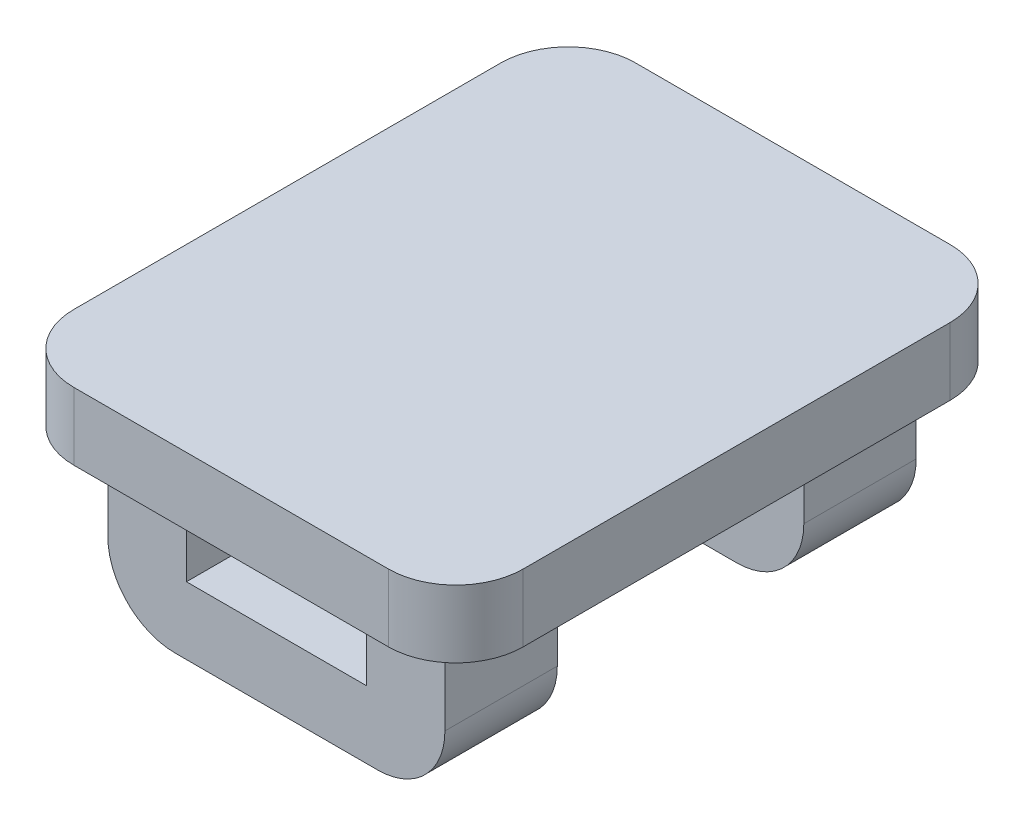
ISO-10303-21;
HEADER;
FILE_DESCRIPTION(('STEP AP214'),'2;1');
FILE_NAME('part.step','',(''),(''),'','','');
FILE_SCHEMA(('AUTOMOTIVE_DESIGN { 1 0 10303 214 1 1 1 1 }'));
ENDSEC;
DATA;
#1=APPLICATION_CONTEXT('core data for automotive mechanical design processes');
#2=APPLICATION_PROTOCOL_DEFINITION('international standard','automotive_design',2000,#1);
#3=PRODUCT_CONTEXT('',#1,'mechanical');
#4=PRODUCT('Part','Part','',(#3));
#5=PRODUCT_RELATED_PRODUCT_CATEGORY('part','',(#4));
#6=PRODUCT_DEFINITION_FORMATION('','',#4);
#7=PRODUCT_DEFINITION_CONTEXT('part definition',#1,'design');
#8=PRODUCT_DEFINITION('design','',#6,#7);
#9=PRODUCT_DEFINITION_SHAPE('','',#8);
#10=(LENGTH_UNIT() NAMED_UNIT(*) SI_UNIT(.MILLI.,.METRE.));
#11=(NAMED_UNIT(*) PLANE_ANGLE_UNIT() SI_UNIT($,.RADIAN.));
#12=(NAMED_UNIT(*) SI_UNIT($,.STERADIAN.) SOLID_ANGLE_UNIT());
#13=UNCERTAINTY_MEASURE_WITH_UNIT(LENGTH_MEASURE(1.E-05),#10,'distance_accuracy_value','');
#14=(GEOMETRIC_REPRESENTATION_CONTEXT(3) GLOBAL_UNCERTAINTY_ASSIGNED_CONTEXT((#13)) GLOBAL_UNIT_ASSIGNED_CONTEXT((#10,
#11,#12)) REPRESENTATION_CONTEXT('',''));
#15=CARTESIAN_POINT('',(0.,0.,0.));
#16=DIRECTION('',(0.,0.,1.));
#17=DIRECTION('',(1.,0.,0.));
#18=AXIS2_PLACEMENT_3D('',#15,#16,#17);
#19=CARTESIAN_POINT('',(0.,0.,0.));
#20=DIRECTION('',(0.,-1.,0.));
#21=DIRECTION('',(0.,0.,-1.));
#22=AXIS2_PLACEMENT_3D('',#19,#20,#21);
#23=PLANE('',#22);
#24=DIRECTION('',(-1.,0.,0.));
#25=VECTOR('',#24,1.);
#26=CARTESIAN_POINT('',(-10.,0.,-12.5));
#27=LINE('',#26,#25);
#28=CARTESIAN_POINT('',(7.,0.,-12.5));
#29=VERTEX_POINT('',#28);
#30=CARTESIAN_POINT('',(-7.,0.,-12.5));
#31=VERTEX_POINT('',#30);
#32=EDGE_CURVE('E394',#29,#31,#27,.T.);
#33=ORIENTED_EDGE('',*,*,#32,.F.);
#34=CARTESIAN_POINT('',(7.,0.,-9.5));
#35=DIRECTION('',(0.,-1.,0.));
#36=DIRECTION('',(0.,0.,-1.));
#37=AXIS2_PLACEMENT_3D('',#34,#35,#36);
#38=CIRCLE('',#37,3.);
#39=CARTESIAN_POINT('',(10.,0.,-9.5));
#40=VERTEX_POINT('',#39);
#41=EDGE_CURVE('E420',#29,#40,#38,.T.);
#42=ORIENTED_EDGE('',*,*,#41,.T.);
#43=DIRECTION('',(0.,0.,-1.));
#44=VECTOR('',#43,1.);
#45=CARTESIAN_POINT('',(10.,0.,12.5));
#46=LINE('',#45,#44);
#47=CARTESIAN_POINT('',(10.,0.,9.5));
#48=VERTEX_POINT('',#47);
#49=EDGE_CURVE('E372',#48,#40,#46,.T.);
#50=ORIENTED_EDGE('',*,*,#49,.F.);
#51=CARTESIAN_POINT('',(7.,0.,9.5));
#52=DIRECTION('',(0.,-1.,0.));
#53=DIRECTION('',(0.,0.,-1.));
#54=AXIS2_PLACEMENT_3D('',#51,#52,#53);
#55=CIRCLE('',#54,3.);
#56=CARTESIAN_POINT('',(7.,0.,12.5));
#57=VERTEX_POINT('',#56);
#58=EDGE_CURVE('E411',#48,#57,#55,.T.);
#59=ORIENTED_EDGE('',*,*,#58,.T.);
#60=DIRECTION('',(1.,0.,0.));
#61=VECTOR('',#60,1.);
#62=CARTESIAN_POINT('',(-10.,0.,12.5));
#63=LINE('',#62,#61);
#64=CARTESIAN_POINT('',(-7.,0.,12.5));
#65=VERTEX_POINT('',#64);
#66=EDGE_CURVE('E378',#65,#57,#63,.T.);
#67=ORIENTED_EDGE('',*,*,#66,.F.);
#68=CARTESIAN_POINT('',(-7.,0.,9.5));
#69=DIRECTION('',(0.,-1.,0.));
#70=DIRECTION('',(0.,0.,-1.));
#71=AXIS2_PLACEMENT_3D('',#68,#69,#70);
#72=CIRCLE('',#71,3.);
#73=CARTESIAN_POINT('',(-10.,0.,9.5));
#74=VERTEX_POINT('',#73);
#75=EDGE_CURVE('E414',#65,#74,#72,.T.);
#76=ORIENTED_EDGE('',*,*,#75,.T.);
#77=DIRECTION('',(0.,0.,1.));
#78=VECTOR('',#77,1.);
#79=CARTESIAN_POINT('',(-10.,0.,12.5));
#80=LINE('',#79,#78);
#81=CARTESIAN_POINT('',(-10.,0.,-9.5));
#82=VERTEX_POINT('',#81);
#83=EDGE_CURVE('E398',#82,#74,#80,.T.);
#84=ORIENTED_EDGE('',*,*,#83,.F.);
#85=CARTESIAN_POINT('',(-7.,0.,-9.5));
#86=DIRECTION('',(0.,-1.,0.));
#87=DIRECTION('',(0.,0.,-1.));
#88=AXIS2_PLACEMENT_3D('',#85,#86,#87);
#89=CIRCLE('',#88,3.);
#90=EDGE_CURVE('E417',#82,#31,#89,.T.);
#91=ORIENTED_EDGE('',*,*,#90,.T.);
#92=EDGE_LOOP('',(#33,#42,#50,#59,#67,#76,#84,#91));
#93=FACE_BOUND('',#92,.T.);
#94=DIRECTION('',(1.,0.,0.));
#95=VECTOR('',#94,1.);
#96=CARTESIAN_POINT('',(7.5,0.,-10.4849434227831));
#97=LINE('',#96,#95);
#98=CARTESIAN_POINT('',(-7.5,0.,-10.4849434227831));
#99=VERTEX_POINT('',#98);
#100=CARTESIAN_POINT('',(7.5,0.,-10.4849434227831));
#101=VERTEX_POINT('',#100);
#102=EDGE_CURVE('E350',#99,#101,#97,.T.);
#103=ORIENTED_EDGE('',*,*,#102,.F.);
#104=DIRECTION('',(0.,0.,-1.));
#105=VECTOR('',#104,1.);
#106=CARTESIAN_POINT('',(-7.5,0.,-10.4849434227831));
#107=LINE('',#106,#105);
#108=CARTESIAN_POINT('',(-7.50000000000001,0.,-5.48494342278312));
#109=VERTEX_POINT('',#108);
#110=EDGE_CURVE('E336',#109,#99,#107,.T.);
#111=ORIENTED_EDGE('',*,*,#110,.F.);
#112=DIRECTION('',(-1.,0.,0.));
#113=VECTOR('',#112,1.);
#114=CARTESIAN_POINT('',(7.5,0.,-5.48494342278311));
#115=LINE('',#114,#113);
#116=CARTESIAN_POINT('',(7.5,0.,-5.48494342278311));
#117=VERTEX_POINT('',#116);
#118=EDGE_CURVE('E342',#117,#109,#115,.T.);
#119=ORIENTED_EDGE('',*,*,#118,.F.);
#120=DIRECTION('',(0.,0.,1.));
#121=VECTOR('',#120,1.);
#122=CARTESIAN_POINT('',(7.5,0.,-10.4849434227831));
#123=LINE('',#122,#121);
#124=EDGE_CURVE('E354',#101,#117,#123,.T.);
#125=ORIENTED_EDGE('',*,*,#124,.F.);
#126=EDGE_LOOP('',(#103,#111,#119,#125));
#127=FACE_BOUND('',#126,.T.);
#128=DIRECTION('',(-1.,0.,0.));
#129=VECTOR('',#128,1.);
#130=CARTESIAN_POINT('',(7.5,0.,10.4849434227831));
#131=LINE('',#130,#129);
#132=CARTESIAN_POINT('',(7.5,0.,10.4849434227831));
#133=VERTEX_POINT('',#132);
#134=CARTESIAN_POINT('',(-7.5,0.,10.4849434227831));
#135=VERTEX_POINT('',#134);
#136=EDGE_CURVE('E314',#133,#135,#131,.T.);
#137=ORIENTED_EDGE('',*,*,#136,.F.);
#138=DIRECTION('',(0.,0.,1.));
#139=VECTOR('',#138,1.);
#140=CARTESIAN_POINT('',(7.5,0.,10.4849434227831));
#141=LINE('',#140,#139);
#142=CARTESIAN_POINT('',(7.5,0.,5.48494342278311));
#143=VERTEX_POINT('',#142);
#144=EDGE_CURVE('E300',#143,#133,#141,.T.);
#145=ORIENTED_EDGE('',*,*,#144,.F.);
#146=DIRECTION('',(1.,0.,0.));
#147=VECTOR('',#146,1.);
#148=CARTESIAN_POINT('',(7.5,0.,5.48494342278311));
#149=LINE('',#148,#147);
#150=CARTESIAN_POINT('',(-7.50000000000001,0.,5.48494342278312));
#151=VERTEX_POINT('',#150);
#152=EDGE_CURVE('E306',#151,#143,#149,.T.);
#153=ORIENTED_EDGE('',*,*,#152,.F.);
#154=DIRECTION('',(0.,0.,-1.));
#155=VECTOR('',#154,1.);
#156=CARTESIAN_POINT('',(-7.5,0.,10.4849434227831));
#157=LINE('',#156,#155);
#158=EDGE_CURVE('E318',#135,#151,#157,.T.);
#159=ORIENTED_EDGE('',*,*,#158,.F.);
#160=EDGE_LOOP('',(#137,#145,#153,#159));
#161=FACE_BOUND('',#160,.T.);
#162=ADVANCED_FACE('F39',(#93,#127,#161),#23,.T.);
#163=CARTESIAN_POINT('',(10.,3.,12.5));
#164=DIRECTION('',(-1.,0.,0.));
#165=DIRECTION('',(0.,0.,1.));
#166=AXIS2_PLACEMENT_3D('',#163,#164,#165);
#167=PLANE('',#166);
#168=ORIENTED_EDGE('',*,*,#49,.T.);
#169=DIRECTION('',(0.,-1.,0.));
#170=VECTOR('',#169,1.);
#171=CARTESIAN_POINT('',(10.,3.,-9.5));
#172=LINE('',#171,#170);
#173=CARTESIAN_POINT('',(10.,3.,-9.5));
#174=VERTEX_POINT('',#173);
#175=EDGE_CURVE('E427',#40,#174,#172,.F.);
#176=ORIENTED_EDGE('',*,*,#175,.T.);
#177=DIRECTION('',(0.,0.,-1.));
#178=VECTOR('',#177,1.);
#179=CARTESIAN_POINT('',(10.,3.,12.5));
#180=LINE('',#179,#178);
#181=CARTESIAN_POINT('',(10.,3.,9.5));
#182=VERTEX_POINT('',#181);
#183=EDGE_CURVE('E373',#182,#174,#180,.T.);
#184=ORIENTED_EDGE('',*,*,#183,.F.);
#185=DIRECTION('',(0.,-1.,0.));
#186=VECTOR('',#185,1.);
#187=CARTESIAN_POINT('',(10.,3.,9.5));
#188=LINE('',#187,#186);
#189=EDGE_CURVE('E423',#182,#48,#188,.T.);
#190=ORIENTED_EDGE('',*,*,#189,.T.);
#191=EDGE_LOOP('',(#168,#176,#184,#190));
#192=FACE_BOUND('',#191,.T.);
#193=ADVANCED_FACE('F548',(#192),#167,.F.);
#194=CARTESIAN_POINT('',(-10.,3.,-12.5));
#195=DIRECTION('',(0.,0.,1.));
#196=DIRECTION('',(1.,0.,0.));
#197=AXIS2_PLACEMENT_3D('',#194,#195,#196);
#198=PLANE('',#197);
#199=DIRECTION('',(-1.,0.,0.));
#200=VECTOR('',#199,1.);
#201=CARTESIAN_POINT('',(-10.,3.,-12.5));
#202=LINE('',#201,#200);
#203=CARTESIAN_POINT('',(7.,3.,-12.5));
#204=VERTEX_POINT('',#203);
#205=CARTESIAN_POINT('',(-7.,3.,-12.5));
#206=VERTEX_POINT('',#205);
#207=EDGE_CURVE('E377',#204,#206,#202,.T.);
#208=ORIENTED_EDGE('',*,*,#207,.F.);
#209=DIRECTION('',(0.,-1.,0.));
#210=VECTOR('',#209,1.);
#211=CARTESIAN_POINT('',(7.,3.,-12.5));
#212=LINE('',#211,#210);
#213=EDGE_CURVE('E407',#204,#29,#212,.T.);
#214=ORIENTED_EDGE('',*,*,#213,.T.);
#215=ORIENTED_EDGE('',*,*,#32,.T.);
#216=DIRECTION('',(0.,-1.,0.));
#217=VECTOR('',#216,1.);
#218=CARTESIAN_POINT('',(-7.,3.,-12.5));
#219=LINE('',#218,#217);
#220=EDGE_CURVE('E390',#31,#206,#219,.F.);
#221=ORIENTED_EDGE('',*,*,#220,.T.);
#222=EDGE_LOOP('',(#208,#214,#215,#221));
#223=FACE_BOUND('',#222,.T.);
#224=ADVANCED_FACE('F554',(#223),#198,.F.);
#225=CARTESIAN_POINT('',(-10.,3.,12.5));
#226=DIRECTION('',(1.,0.,0.));
#227=DIRECTION('',(0.,0.,-1.));
#228=AXIS2_PLACEMENT_3D('',#225,#226,#227);
#229=PLANE('',#228);
#230=DIRECTION('',(0.,0.,1.));
#231=VECTOR('',#230,1.);
#232=CARTESIAN_POINT('',(-10.,3.,12.5));
#233=LINE('',#232,#231);
#234=CARTESIAN_POINT('',(-10.,3.,-9.5));
#235=VERTEX_POINT('',#234);
#236=CARTESIAN_POINT('',(-10.,3.,9.5));
#237=VERTEX_POINT('',#236);
#238=EDGE_CURVE('E382',#235,#237,#233,.T.);
#239=ORIENTED_EDGE('',*,*,#238,.F.);
#240=DIRECTION('',(0.,-1.,0.));
#241=VECTOR('',#240,1.);
#242=CARTESIAN_POINT('',(-10.,3.,-9.5));
#243=LINE('',#242,#241);
#244=EDGE_CURVE('E445',#235,#82,#243,.T.);
#245=ORIENTED_EDGE('',*,*,#244,.T.);
#246=ORIENTED_EDGE('',*,*,#83,.T.);
#247=DIRECTION('',(0.,-1.,0.));
#248=VECTOR('',#247,1.);
#249=CARTESIAN_POINT('',(-10.,3.,9.5));
#250=LINE('',#249,#248);
#251=EDGE_CURVE('E442',#74,#237,#250,.F.);
#252=ORIENTED_EDGE('',*,*,#251,.T.);
#253=EDGE_LOOP('',(#239,#245,#246,#252));
#254=FACE_BOUND('',#253,.T.);
#255=ADVANCED_FACE('F565',(#254),#229,.F.);
#256=CARTESIAN_POINT('',(-10.,3.,12.5));
#257=DIRECTION('',(0.,0.,-1.));
#258=DIRECTION('',(-1.,0.,0.));
#259=AXIS2_PLACEMENT_3D('',#256,#257,#258);
#260=PLANE('',#259);
#261=DIRECTION('',(1.,0.,0.));
#262=VECTOR('',#261,1.);
#263=CARTESIAN_POINT('',(-10.,3.,12.5));
#264=LINE('',#263,#262);
#265=CARTESIAN_POINT('',(-7.,3.,12.5));
#266=VERTEX_POINT('',#265);
#267=CARTESIAN_POINT('',(7.,3.,12.5));
#268=VERTEX_POINT('',#267);
#269=EDGE_CURVE('E386',#266,#268,#264,.T.);
#270=ORIENTED_EDGE('',*,*,#269,.F.);
#271=DIRECTION('',(0.,-1.,0.));
#272=VECTOR('',#271,1.);
#273=CARTESIAN_POINT('',(-7.,3.,12.5));
#274=LINE('',#273,#272);
#275=EDGE_CURVE('E452',#266,#65,#274,.T.);
#276=ORIENTED_EDGE('',*,*,#275,.T.);
#277=ORIENTED_EDGE('',*,*,#66,.T.);
#278=DIRECTION('',(0.,-1.,0.));
#279=VECTOR('',#278,1.);
#280=CARTESIAN_POINT('',(7.,3.,12.5));
#281=LINE('',#280,#279);
#282=EDGE_CURVE('E449',#57,#268,#281,.F.);
#283=ORIENTED_EDGE('',*,*,#282,.T.);
#284=EDGE_LOOP('',(#270,#276,#277,#283));
#285=FACE_BOUND('',#284,.T.);
#286=ADVANCED_FACE('F562',(#285),#260,.F.);
#287=CARTESIAN_POINT('',(0.,3.,0.));
#288=DIRECTION('',(0.,-1.,0.));
#289=DIRECTION('',(0.,0.,-1.));
#290=AXIS2_PLACEMENT_3D('',#287,#288,#289);
#291=PLANE('',#290);
#292=ORIENTED_EDGE('',*,*,#183,.T.);
#293=CARTESIAN_POINT('',(7.,3.,-9.5));
#294=DIRECTION('',(0.,-1.,0.));
#295=DIRECTION('',(0.,0.,-1.));
#296=AXIS2_PLACEMENT_3D('',#293,#294,#295);
#297=CIRCLE('',#296,3.);
#298=EDGE_CURVE('E439',#174,#204,#297,.F.);
#299=ORIENTED_EDGE('',*,*,#298,.T.);
#300=ORIENTED_EDGE('',*,*,#207,.T.);
#301=CARTESIAN_POINT('',(-7.,3.,-9.5));
#302=DIRECTION('',(0.,-1.,0.));
#303=DIRECTION('',(0.,0.,-1.));
#304=AXIS2_PLACEMENT_3D('',#301,#302,#303);
#305=CIRCLE('',#304,3.);
#306=EDGE_CURVE('E436',#206,#235,#305,.F.);
#307=ORIENTED_EDGE('',*,*,#306,.T.);
#308=ORIENTED_EDGE('',*,*,#238,.T.);
#309=CARTESIAN_POINT('',(-7.,3.,9.5));
#310=DIRECTION('',(0.,-1.,0.));
#311=DIRECTION('',(0.,0.,-1.));
#312=AXIS2_PLACEMENT_3D('',#309,#310,#311);
#313=CIRCLE('',#312,3.);
#314=EDGE_CURVE('E433',#237,#266,#313,.F.);
#315=ORIENTED_EDGE('',*,*,#314,.T.);
#316=ORIENTED_EDGE('',*,*,#269,.T.);
#317=CARTESIAN_POINT('',(7.,3.,9.5));
#318=DIRECTION('',(0.,-1.,0.));
#319=DIRECTION('',(0.,0.,-1.));
#320=AXIS2_PLACEMENT_3D('',#317,#318,#319);
#321=CIRCLE('',#320,3.);
#322=EDGE_CURVE('E430',#268,#182,#321,.F.);
#323=ORIENTED_EDGE('',*,*,#322,.T.);
#324=EDGE_LOOP('',(#292,#299,#300,#307,#308,#315,#316,#323));
#325=FACE_BOUND('',#324,.T.);
#326=ADVANCED_FACE('F560',(#325),#291,.F.);
#327=CARTESIAN_POINT('',(-7.5,-7.,-10.4849434227831));
#328=DIRECTION('',(1.,0.,0.));
#329=DIRECTION('',(0.,0.,-1.));
#330=AXIS2_PLACEMENT_3D('',#327,#328,#329);
#331=PLANE('',#330);
#332=DIRECTION('',(0.,1.,0.));
#333=VECTOR('',#332,1.);
#334=CARTESIAN_POINT('',(-7.5,-7.,-10.4849434227831));
#335=LINE('',#334,#333);
#336=CARTESIAN_POINT('',(-7.5,-4.,-10.4849434227831));
#337=VERTEX_POINT('',#336);
#338=EDGE_CURVE('E369',#337,#99,#335,.T.);
#339=ORIENTED_EDGE('',*,*,#338,.F.);
#340=DIRECTION('',(0.,0.,-1.));
#341=VECTOR('',#340,1.);
#342=CARTESIAN_POINT('',(-7.50000000000001,-4.,-5.48494342278312));
#343=LINE('',#342,#341);
#344=CARTESIAN_POINT('',(-7.50000000000001,-4.,-5.48494342278312));
#345=VERTEX_POINT('',#344);
#346=EDGE_CURVE('E63',#337,#345,#343,.F.);
#347=ORIENTED_EDGE('',*,*,#346,.T.);
#348=DIRECTION('',(0.,1.,0.));
#349=VECTOR('',#348,1.);
#350=CARTESIAN_POINT('',(-7.50000000000001,-7.,-5.48494342278312));
#351=LINE('',#350,#349);
#352=EDGE_CURVE('E346',#345,#109,#351,.T.);
#353=ORIENTED_EDGE('',*,*,#352,.T.);
#354=ORIENTED_EDGE('',*,*,#110,.T.);
#355=EDGE_LOOP('',(#339,#347,#353,#354));
#356=FACE_BOUND('',#355,.T.);
#357=ADVANCED_FACE('F525',(#356),#331,.F.);
#358=CARTESIAN_POINT('',(7.5,-7.,-10.4849434227831));
#359=DIRECTION('',(0.,0.,1.));
#360=DIRECTION('',(1.,0.,0.));
#361=AXIS2_PLACEMENT_3D('',#358,#359,#360);
#362=PLANE('',#361);
#363=DIRECTION('',(1.,0.,0.));
#364=VECTOR('',#363,1.);
#365=CARTESIAN_POINT('',(4.,-0.999999999999999,-10.4849434227831));
#366=LINE('',#365,#364);
#367=CARTESIAN_POINT('',(-4.,-0.999999999999999,-10.4849434227831));
#368=VERTEX_POINT('',#367);
#369=CARTESIAN_POINT('',(4.,-0.999999999999999,-10.4849434227831));
#370=VERTEX_POINT('',#369);
#371=EDGE_CURVE('E242',#368,#370,#366,.T.);
#372=ORIENTED_EDGE('',*,*,#371,.F.);
#373=DIRECTION('',(0.,1.,0.));
#374=VECTOR('',#373,1.);
#375=CARTESIAN_POINT('',(-4.,-0.999999999999999,-10.4849434227831));
#376=LINE('',#375,#374);
#377=CARTESIAN_POINT('',(-4.,-4.,-10.4849434227831));
#378=VERTEX_POINT('',#377);
#379=EDGE_CURVE('E249',#378,#368,#376,.T.);
#380=ORIENTED_EDGE('',*,*,#379,.F.);
#381=DIRECTION('',(-1.,0.,0.));
#382=VECTOR('',#381,1.);
#383=CARTESIAN_POINT('',(4.,-4.,-10.4849434227831));
#384=LINE('',#383,#382);
#385=CARTESIAN_POINT('',(4.,-4.,-10.4849434227831));
#386=VERTEX_POINT('',#385);
#387=EDGE_CURVE('E254',#386,#378,#384,.T.);
#388=ORIENTED_EDGE('',*,*,#387,.F.);
#389=DIRECTION('',(0.,-1.,0.));
#390=VECTOR('',#389,1.);
#391=CARTESIAN_POINT('',(4.,-0.999999999999999,-10.4849434227831));
#392=LINE('',#391,#390);
#393=EDGE_CURVE('E230',#370,#386,#392,.T.);
#394=ORIENTED_EDGE('',*,*,#393,.F.);
#395=EDGE_LOOP('',(#372,#380,#388,#394));
#396=FACE_BOUND('',#395,.T.);
#397=DIRECTION('',(1.,0.,0.));
#398=VECTOR('',#397,1.);
#399=CARTESIAN_POINT('',(7.5,-7.,-10.4849434227831));
#400=LINE('',#399,#398);
#401=CARTESIAN_POINT('',(-4.5,-7.,-10.4849434227831));
#402=VERTEX_POINT('',#401);
#403=CARTESIAN_POINT('',(4.5,-7.,-10.4849434227831));
#404=VERTEX_POINT('',#403);
#405=EDGE_CURVE('E337',#402,#404,#400,.T.);
#406=ORIENTED_EDGE('',*,*,#405,.F.);
#407=CARTESIAN_POINT('',(-4.5,-4.,-10.4849434227831));
#408=DIRECTION('',(0.,0.,1.));
#409=DIRECTION('',(1.,0.,0.));
#410=AXIS2_PLACEMENT_3D('',#407,#408,#409);
#411=CIRCLE('',#410,3.);
#412=EDGE_CURVE('E509',#402,#337,#411,.F.);
#413=ORIENTED_EDGE('',*,*,#412,.T.);
#414=ORIENTED_EDGE('',*,*,#338,.T.);
#415=ORIENTED_EDGE('',*,*,#102,.T.);
#416=DIRECTION('',(0.,1.,0.));
#417=VECTOR('',#416,1.);
#418=CARTESIAN_POINT('',(7.5,-7.,-10.4849434227831));
#419=LINE('',#418,#417);
#420=CARTESIAN_POINT('',(7.5,-4.,-10.4849434227831));
#421=VERTEX_POINT('',#420);
#422=EDGE_CURVE('E366',#421,#101,#419,.T.);
#423=ORIENTED_EDGE('',*,*,#422,.F.);
#424=CARTESIAN_POINT('',(4.5,-4.,-10.4849434227831));
#425=DIRECTION('',(0.,0.,1.));
#426=DIRECTION('',(1.,0.,0.));
#427=AXIS2_PLACEMENT_3D('',#424,#425,#426);
#428=CIRCLE('',#427,3.);
#429=EDGE_CURVE('E506',#421,#404,#428,.F.);
#430=ORIENTED_EDGE('',*,*,#429,.T.);
#431=EDGE_LOOP('',(#406,#413,#414,#415,#423,#430));
#432=FACE_BOUND('',#431,.T.);
#433=ADVANCED_FACE('F251',(#396,#432),#362,.F.);
#434=CARTESIAN_POINT('',(7.5,-7.,-10.4849434227831));
#435=DIRECTION('',(-1.,0.,0.));
#436=DIRECTION('',(0.,0.,1.));
#437=AXIS2_PLACEMENT_3D('',#434,#435,#436);
#438=PLANE('',#437);
#439=DIRECTION('',(0.,1.,0.));
#440=VECTOR('',#439,1.);
#441=CARTESIAN_POINT('',(7.5,-7.,-5.48494342278311));
#442=LINE('',#441,#440);
#443=CARTESIAN_POINT('',(7.5,-4.,-5.48494342278311));
#444=VERTEX_POINT('',#443);
#445=EDGE_CURVE('E363',#444,#117,#442,.T.);
#446=ORIENTED_EDGE('',*,*,#445,.F.);
#447=DIRECTION('',(0.,0.,1.));
#448=VECTOR('',#447,1.);
#449=CARTESIAN_POINT('',(7.5,-4.,-10.4849434227831));
#450=LINE('',#449,#448);
#451=EDGE_CURVE('E11',#444,#421,#450,.F.);
#452=ORIENTED_EDGE('',*,*,#451,.T.);
#453=ORIENTED_EDGE('',*,*,#422,.T.);
#454=ORIENTED_EDGE('',*,*,#124,.T.);
#455=EDGE_LOOP('',(#446,#452,#453,#454));
#456=FACE_BOUND('',#455,.T.);
#457=ADVANCED_FACE('F537',(#456),#438,.F.);
#458=CARTESIAN_POINT('',(7.5,-7.,-5.48494342278311));
#459=DIRECTION('',(0.,0.,-1.));
#460=DIRECTION('',(-1.,0.,0.));
#461=AXIS2_PLACEMENT_3D('',#458,#459,#460);
#462=PLANE('',#461);
#463=DIRECTION('',(-1.,0.,0.));
#464=VECTOR('',#463,1.);
#465=CARTESIAN_POINT('',(7.5,-4.,-5.48494342278311));
#466=LINE('',#465,#464);
#467=CARTESIAN_POINT('',(4.,-4.,-5.48494342278311));
#468=VERTEX_POINT('',#467);
#469=CARTESIAN_POINT('',(-4.,-4.,-5.48494342278311));
#470=VERTEX_POINT('',#469);
#471=EDGE_CURVE('E288',#468,#470,#466,.T.);
#472=ORIENTED_EDGE('',*,*,#471,.T.);
#473=DIRECTION('',(0.,1.,0.));
#474=VECTOR('',#473,1.);
#475=CARTESIAN_POINT('',(-4.,-7.,-5.48494342278312));
#476=LINE('',#475,#474);
#477=CARTESIAN_POINT('',(-4.,-0.999999999999999,-5.48494342278311));
#478=VERTEX_POINT('',#477);
#479=EDGE_CURVE('E296',#470,#478,#476,.T.);
#480=ORIENTED_EDGE('',*,*,#479,.T.);
#481=DIRECTION('',(1.,0.,0.));
#482=VECTOR('',#481,1.);
#483=CARTESIAN_POINT('',(7.5,-0.999999999999999,-5.48494342278311));
#484=LINE('',#483,#482);
#485=CARTESIAN_POINT('',(4.,-0.999999999999999,-5.48494342278311));
#486=VERTEX_POINT('',#485);
#487=EDGE_CURVE('E275',#478,#486,#484,.T.);
#488=ORIENTED_EDGE('',*,*,#487,.T.);
#489=DIRECTION('',(0.,-1.,0.));
#490=VECTOR('',#489,1.);
#491=CARTESIAN_POINT('',(4.,-7.,-5.48494342278311));
#492=LINE('',#491,#490);
#493=EDGE_CURVE('E233',#486,#468,#492,.T.);
#494=ORIENTED_EDGE('',*,*,#493,.T.);
#495=EDGE_LOOP('',(#472,#480,#488,#494));
#496=FACE_BOUND('',#495,.T.);
#497=ORIENTED_EDGE('',*,*,#352,.F.);
#498=CARTESIAN_POINT('',(-4.5,-4.,-5.48494342278312));
#499=DIRECTION('',(0.,0.,-1.));
#500=DIRECTION('',(-1.,0.,0.));
#501=AXIS2_PLACEMENT_3D('',#498,#499,#500);
#502=CIRCLE('',#501,3.);
#503=CARTESIAN_POINT('',(-4.5,-7.,-5.48494342278312));
#504=VERTEX_POINT('',#503);
#505=EDGE_CURVE('E48',#345,#504,#502,.F.);
#506=ORIENTED_EDGE('',*,*,#505,.T.);
#507=DIRECTION('',(-1.,0.,0.));
#508=VECTOR('',#507,1.);
#509=CARTESIAN_POINT('',(7.5,-7.,-5.48494342278311));
#510=LINE('',#509,#508);
#511=CARTESIAN_POINT('',(4.5,-7.,-5.48494342278311));
#512=VERTEX_POINT('',#511);
#513=EDGE_CURVE('E341',#512,#504,#510,.T.);
#514=ORIENTED_EDGE('',*,*,#513,.F.);
#515=CARTESIAN_POINT('',(4.5,-4.,-5.48494342278311));
#516=DIRECTION('',(0.,0.,-1.));
#517=DIRECTION('',(-1.,0.,0.));
#518=AXIS2_PLACEMENT_3D('',#515,#516,#517);
#519=CIRCLE('',#518,3.);
#520=EDGE_CURVE('E55',#512,#444,#519,.F.);
#521=ORIENTED_EDGE('',*,*,#520,.T.);
#522=ORIENTED_EDGE('',*,*,#445,.T.);
#523=ORIENTED_EDGE('',*,*,#118,.T.);
#524=EDGE_LOOP('',(#497,#506,#514,#521,#522,#523));
#525=FACE_BOUND('',#524,.T.);
#526=ADVANCED_FACE('F517',(#496,#525),#462,.F.);
#527=CARTESIAN_POINT('',(0.,-7.,0.));
#528=DIRECTION('',(0.,-1.,0.));
#529=DIRECTION('',(0.,0.,-1.));
#530=AXIS2_PLACEMENT_3D('',#527,#528,#529);
#531=PLANE('',#530);
#532=ORIENTED_EDGE('',*,*,#513,.T.);
#533=DIRECTION('',(0.,0.,-1.));
#534=VECTOR('',#533,1.);
#535=CARTESIAN_POINT('',(-4.5,-7.,-10.4849434227831));
#536=LINE('',#535,#534);
#537=EDGE_CURVE('E502',#504,#402,#536,.T.);
#538=ORIENTED_EDGE('',*,*,#537,.T.);
#539=ORIENTED_EDGE('',*,*,#405,.T.);
#540=DIRECTION('',(0.,0.,1.));
#541=VECTOR('',#540,1.);
#542=CARTESIAN_POINT('',(4.5,-7.,-5.48494342278311));
#543=LINE('',#542,#541);
#544=EDGE_CURVE('E498',#404,#512,#543,.T.);
#545=ORIENTED_EDGE('',*,*,#544,.T.);
#546=EDGE_LOOP('',(#532,#538,#539,#545));
#547=FACE_BOUND('',#546,.T.);
#548=ADVANCED_FACE('F521',(#547),#531,.T.);
#549=CARTESIAN_POINT('',(7.5,-7.,10.4849434227831));
#550=DIRECTION('',(-1.,0.,0.));
#551=DIRECTION('',(0.,0.,1.));
#552=AXIS2_PLACEMENT_3D('',#549,#550,#551);
#553=PLANE('',#552);
#554=DIRECTION('',(0.,1.,0.));
#555=VECTOR('',#554,1.);
#556=CARTESIAN_POINT('',(7.5,-7.,10.4849434227831));
#557=LINE('',#556,#555);
#558=CARTESIAN_POINT('',(7.5,-4.,10.4849434227831));
#559=VERTEX_POINT('',#558);
#560=EDGE_CURVE('E333',#559,#133,#557,.T.);
#561=ORIENTED_EDGE('',*,*,#560,.F.);
#562=DIRECTION('',(0.,0.,1.));
#563=VECTOR('',#562,1.);
#564=CARTESIAN_POINT('',(7.5,-4.,10.4849434227831));
#565=LINE('',#564,#563);
#566=CARTESIAN_POINT('',(7.5,-4.,5.48494342278311));
#567=VERTEX_POINT('',#566);
#568=EDGE_CURVE('E495',#559,#567,#565,.F.);
#569=ORIENTED_EDGE('',*,*,#568,.T.);
#570=DIRECTION('',(0.,1.,0.));
#571=VECTOR('',#570,1.);
#572=CARTESIAN_POINT('',(7.5,-7.,5.48494342278311));
#573=LINE('',#572,#571);
#574=EDGE_CURVE('E310',#567,#143,#573,.T.);
#575=ORIENTED_EDGE('',*,*,#574,.T.);
#576=ORIENTED_EDGE('',*,*,#144,.T.);
#577=EDGE_LOOP('',(#561,#569,#575,#576));
#578=FACE_BOUND('',#577,.T.);
#579=ADVANCED_FACE('F662',(#578),#553,.F.);
#580=CARTESIAN_POINT('',(7.5,-7.,10.4849434227831));
#581=DIRECTION('',(0.,0.,-1.));
#582=DIRECTION('',(-1.,0.,0.));
#583=AXIS2_PLACEMENT_3D('',#580,#581,#582);
#584=PLANE('',#583);
#585=DIRECTION('',(-1.,0.,0.));
#586=VECTOR('',#585,1.);
#587=CARTESIAN_POINT('',(7.5,-4.,10.4849434227831));
#588=LINE('',#587,#586);
#589=CARTESIAN_POINT('',(4.,-4.,10.4849434227831));
#590=VERTEX_POINT('',#589);
#591=CARTESIAN_POINT('',(-4.,-4.,10.4849434227831));
#592=VERTEX_POINT('',#591);
#593=EDGE_CURVE('E284',#590,#592,#588,.T.);
#594=ORIENTED_EDGE('',*,*,#593,.T.);
#595=DIRECTION('',(0.,1.,0.));
#596=VECTOR('',#595,1.);
#597=CARTESIAN_POINT('',(-4.,-7.,10.4849434227831));
#598=LINE('',#597,#596);
#599=CARTESIAN_POINT('',(-4.,-0.999999999999999,10.4849434227831));
#600=VERTEX_POINT('',#599);
#601=EDGE_CURVE('E292',#592,#600,#598,.T.);
#602=ORIENTED_EDGE('',*,*,#601,.T.);
#603=DIRECTION('',(1.,0.,0.));
#604=VECTOR('',#603,1.);
#605=CARTESIAN_POINT('',(7.5,-0.999999999999999,10.4849434227831));
#606=LINE('',#605,#604);
#607=CARTESIAN_POINT('',(4.,-0.999999999999999,10.4849434227831));
#608=VERTEX_POINT('',#607);
#609=EDGE_CURVE('E271',#600,#608,#606,.T.);
#610=ORIENTED_EDGE('',*,*,#609,.T.);
#611=DIRECTION('',(0.,-1.,0.));
#612=VECTOR('',#611,1.);
#613=CARTESIAN_POINT('',(4.,-7.,10.4849434227831));
#614=LINE('',#613,#612);
#615=EDGE_CURVE('E278',#608,#590,#614,.T.);
#616=ORIENTED_EDGE('',*,*,#615,.T.);
#617=EDGE_LOOP('',(#594,#602,#610,#616));
#618=FACE_BOUND('',#617,.T.);
#619=DIRECTION('',(0.,1.,0.));
#620=VECTOR('',#619,1.);
#621=CARTESIAN_POINT('',(-7.5,-7.,10.4849434227831));
#622=LINE('',#621,#620);
#623=CARTESIAN_POINT('',(-7.5,-4.,10.4849434227831));
#624=VERTEX_POINT('',#623);
#625=EDGE_CURVE('E330',#624,#135,#622,.T.);
#626=ORIENTED_EDGE('',*,*,#625,.F.);
#627=CARTESIAN_POINT('',(-4.5,-4.,10.4849434227831));
#628=DIRECTION('',(0.,0.,-1.));
#629=DIRECTION('',(-1.,0.,0.));
#630=AXIS2_PLACEMENT_3D('',#627,#628,#629);
#631=CIRCLE('',#630,3.);
#632=CARTESIAN_POINT('',(-4.5,-7.,10.4849434227831));
#633=VERTEX_POINT('',#632);
#634=EDGE_CURVE('E492',#624,#633,#631,.F.);
#635=ORIENTED_EDGE('',*,*,#634,.T.);
#636=DIRECTION('',(-1.,0.,0.));
#637=VECTOR('',#636,1.);
#638=CARTESIAN_POINT('',(7.5,-7.,10.4849434227831));
#639=LINE('',#638,#637);
#640=CARTESIAN_POINT('',(4.5,-7.,10.4849434227831));
#641=VERTEX_POINT('',#640);
#642=EDGE_CURVE('E301',#641,#633,#639,.T.);
#643=ORIENTED_EDGE('',*,*,#642,.F.);
#644=CARTESIAN_POINT('',(4.5,-4.,10.4849434227831));
#645=DIRECTION('',(0.,0.,-1.));
#646=DIRECTION('',(-1.,0.,0.));
#647=AXIS2_PLACEMENT_3D('',#644,#645,#646);
#648=CIRCLE('',#647,3.);
#649=EDGE_CURVE('E489',#641,#559,#648,.F.);
#650=ORIENTED_EDGE('',*,*,#649,.T.);
#651=ORIENTED_EDGE('',*,*,#560,.T.);
#652=ORIENTED_EDGE('',*,*,#136,.T.);
#653=EDGE_LOOP('',(#626,#635,#643,#650,#651,#652));
#654=FACE_BOUND('',#653,.T.);
#655=ADVANCED_FACE('F652',(#618,#654),#584,.F.);
#656=CARTESIAN_POINT('',(-7.5,-7.,10.4849434227831));
#657=DIRECTION('',(1.,0.,0.));
#658=DIRECTION('',(0.,0.,-1.));
#659=AXIS2_PLACEMENT_3D('',#656,#657,#658);
#660=PLANE('',#659);
#661=DIRECTION('',(0.,1.,0.));
#662=VECTOR('',#661,1.);
#663=CARTESIAN_POINT('',(-7.50000000000001,-7.,5.48494342278312));
#664=LINE('',#663,#662);
#665=CARTESIAN_POINT('',(-7.50000000000001,-4.,5.48494342278312));
#666=VERTEX_POINT('',#665);
#667=EDGE_CURVE('E327',#666,#151,#664,.T.);
#668=ORIENTED_EDGE('',*,*,#667,.F.);
#669=DIRECTION('',(0.,0.,-1.));
#670=VECTOR('',#669,1.);
#671=CARTESIAN_POINT('',(-7.5,-4.,10.4849434227831));
#672=LINE('',#671,#670);
#673=EDGE_CURVE('E486',#666,#624,#672,.F.);
#674=ORIENTED_EDGE('',*,*,#673,.T.);
#675=ORIENTED_EDGE('',*,*,#625,.T.);
#676=ORIENTED_EDGE('',*,*,#158,.T.);
#677=EDGE_LOOP('',(#668,#674,#675,#676));
#678=FACE_BOUND('',#677,.T.);
#679=ADVANCED_FACE('F642',(#678),#660,.F.);
#680=CARTESIAN_POINT('',(7.5,-7.,5.48494342278311));
#681=DIRECTION('',(0.,0.,1.));
#682=DIRECTION('',(1.,0.,0.));
#683=AXIS2_PLACEMENT_3D('',#680,#681,#682);
#684=PLANE('',#683);
#685=DIRECTION('',(-1.,0.,0.));
#686=VECTOR('',#685,1.);
#687=CARTESIAN_POINT('',(7.5,-0.999999999999999,5.48494342278311));
#688=LINE('',#687,#686);
#689=CARTESIAN_POINT('',(4.,-0.999999999999999,5.48494342278311));
#690=VERTEX_POINT('',#689);
#691=CARTESIAN_POINT('',(-4.,-0.999999999999999,5.48494342278312));
#692=VERTEX_POINT('',#691);
#693=EDGE_CURVE('E456',#690,#692,#688,.T.);
#694=ORIENTED_EDGE('',*,*,#693,.T.);
#695=DIRECTION('',(0.,-1.,0.));
#696=VECTOR('',#695,1.);
#697=CARTESIAN_POINT('',(-4.,-7.,5.48494342278312));
#698=LINE('',#697,#696);
#699=CARTESIAN_POINT('',(-4.,-4.,5.48494342278311));
#700=VERTEX_POINT('',#699);
#701=EDGE_CURVE('E468',#692,#700,#698,.T.);
#702=ORIENTED_EDGE('',*,*,#701,.T.);
#703=DIRECTION('',(1.,0.,0.));
#704=VECTOR('',#703,1.);
#705=CARTESIAN_POINT('',(7.5,-4.,5.48494342278311));
#706=LINE('',#705,#704);
#707=CARTESIAN_POINT('',(4.,-4.,5.48494342278311));
#708=VERTEX_POINT('',#707);
#709=EDGE_CURVE('E464',#700,#708,#706,.T.);
#710=ORIENTED_EDGE('',*,*,#709,.T.);
#711=DIRECTION('',(0.,1.,0.));
#712=VECTOR('',#711,1.);
#713=CARTESIAN_POINT('',(4.,-7.,5.48494342278311));
#714=LINE('',#713,#712);
#715=EDGE_CURVE('E460',#708,#690,#714,.T.);
#716=ORIENTED_EDGE('',*,*,#715,.T.);
#717=EDGE_LOOP('',(#694,#702,#710,#716));
#718=FACE_BOUND('',#717,.T.);
#719=DIRECTION('',(1.,0.,0.));
#720=VECTOR('',#719,1.);
#721=CARTESIAN_POINT('',(7.5,-7.,5.48494342278311));
#722=LINE('',#721,#720);
#723=CARTESIAN_POINT('',(-4.5,-7.,5.48494342278312));
#724=VERTEX_POINT('',#723);
#725=CARTESIAN_POINT('',(4.5,-7.,5.48494342278311));
#726=VERTEX_POINT('',#725);
#727=EDGE_CURVE('E305',#724,#726,#722,.T.);
#728=ORIENTED_EDGE('',*,*,#727,.F.);
#729=CARTESIAN_POINT('',(-4.5,-4.,5.48494342278312));
#730=DIRECTION('',(0.,0.,1.));
#731=DIRECTION('',(1.,0.,0.));
#732=AXIS2_PLACEMENT_3D('',#729,#730,#731);
#733=CIRCLE('',#732,3.);
#734=EDGE_CURVE('E483',#724,#666,#733,.F.);
#735=ORIENTED_EDGE('',*,*,#734,.T.);
#736=ORIENTED_EDGE('',*,*,#667,.T.);
#737=ORIENTED_EDGE('',*,*,#152,.T.);
#738=ORIENTED_EDGE('',*,*,#574,.F.);
#739=CARTESIAN_POINT('',(4.5,-4.,5.48494342278311));
#740=DIRECTION('',(0.,0.,1.));
#741=DIRECTION('',(1.,0.,0.));
#742=AXIS2_PLACEMENT_3D('',#739,#740,#741);
#743=CIRCLE('',#742,3.);
#744=EDGE_CURVE('E480',#567,#726,#743,.F.);
#745=ORIENTED_EDGE('',*,*,#744,.T.);
#746=EDGE_LOOP('',(#728,#735,#736,#737,#738,#745));
#747=FACE_BOUND('',#746,.T.);
#748=ADVANCED_FACE('F631',(#718,#747),#684,.F.);
#749=CARTESIAN_POINT('',(0.,-7.,0.));
#750=DIRECTION('',(0.,1.,0.));
#751=DIRECTION('',(0.,0.,1.));
#752=AXIS2_PLACEMENT_3D('',#749,#750,#751);
#753=PLANE('',#752);
#754=ORIENTED_EDGE('',*,*,#642,.T.);
#755=DIRECTION('',(0.,0.,-1.));
#756=VECTOR('',#755,1.);
#757=CARTESIAN_POINT('',(-4.50000000000001,-7.,0.));
#758=LINE('',#757,#756);
#759=EDGE_CURVE('E476',#633,#724,#758,.T.);
#760=ORIENTED_EDGE('',*,*,#759,.T.);
#761=ORIENTED_EDGE('',*,*,#727,.T.);
#762=DIRECTION('',(0.,0.,1.));
#763=VECTOR('',#762,1.);
#764=CARTESIAN_POINT('',(4.5,-7.,0.));
#765=LINE('',#764,#763);
#766=EDGE_CURVE('E472',#726,#641,#765,.T.);
#767=ORIENTED_EDGE('',*,*,#766,.T.);
#768=EDGE_LOOP('',(#754,#760,#761,#767));
#769=FACE_BOUND('',#768,.T.);
#770=ADVANCED_FACE('F577',(#769),#753,.F.);
#771=CARTESIAN_POINT('',(7.,3.,-9.5));
#772=DIRECTION('',(0.,-1.,0.));
#773=DIRECTION('',(0.,0.,-1.));
#774=AXIS2_PLACEMENT_3D('',#771,#772,#773);
#775=CYLINDRICAL_SURFACE('',#774,3.);
#776=ORIENTED_EDGE('',*,*,#298,.F.);
#777=ORIENTED_EDGE('',*,*,#175,.F.);
#778=ORIENTED_EDGE('',*,*,#41,.F.);
#779=ORIENTED_EDGE('',*,*,#213,.F.);
#780=EDGE_LOOP('',(#776,#777,#778,#779));
#781=FACE_BOUND('',#780,.T.);
#782=ADVANCED_FACE('F573',(#781),#775,.T.);
#783=CARTESIAN_POINT('',(-7.,3.,-9.5));
#784=DIRECTION('',(0.,-1.,0.));
#785=DIRECTION('',(0.,0.,-1.));
#786=AXIS2_PLACEMENT_3D('',#783,#784,#785);
#787=CYLINDRICAL_SURFACE('',#786,3.);
#788=ORIENTED_EDGE('',*,*,#306,.F.);
#789=ORIENTED_EDGE('',*,*,#220,.F.);
#790=ORIENTED_EDGE('',*,*,#90,.F.);
#791=ORIENTED_EDGE('',*,*,#244,.F.);
#792=EDGE_LOOP('',(#788,#789,#790,#791));
#793=FACE_BOUND('',#792,.T.);
#794=ADVANCED_FACE('F576',(#793),#787,.T.);
#795=CARTESIAN_POINT('',(-7.,3.,9.5));
#796=DIRECTION('',(0.,-1.,0.));
#797=DIRECTION('',(0.,0.,-1.));
#798=AXIS2_PLACEMENT_3D('',#795,#796,#797);
#799=CYLINDRICAL_SURFACE('',#798,3.);
#800=ORIENTED_EDGE('',*,*,#314,.F.);
#801=ORIENTED_EDGE('',*,*,#251,.F.);
#802=ORIENTED_EDGE('',*,*,#75,.F.);
#803=ORIENTED_EDGE('',*,*,#275,.F.);
#804=EDGE_LOOP('',(#800,#801,#802,#803));
#805=FACE_BOUND('',#804,.T.);
#806=ADVANCED_FACE('F581',(#805),#799,.T.);
#807=CARTESIAN_POINT('',(7.,3.,9.5));
#808=DIRECTION('',(0.,-1.,0.));
#809=DIRECTION('',(0.,0.,-1.));
#810=AXIS2_PLACEMENT_3D('',#807,#808,#809);
#811=CYLINDRICAL_SURFACE('',#810,3.);
#812=ORIENTED_EDGE('',*,*,#322,.F.);
#813=ORIENTED_EDGE('',*,*,#282,.F.);
#814=ORIENTED_EDGE('',*,*,#58,.F.);
#815=ORIENTED_EDGE('',*,*,#189,.F.);
#816=EDGE_LOOP('',(#812,#813,#814,#815));
#817=FACE_BOUND('',#816,.T.);
#818=ADVANCED_FACE('F585',(#817),#811,.T.);
#819=CARTESIAN_POINT('',(4.,-0.999999999999999,12.5));
#820=DIRECTION('',(0.,1.,0.));
#821=DIRECTION('',(-1.,0.,0.));
#822=AXIS2_PLACEMENT_3D('',#819,#820,#821);
#823=PLANE('',#822);
#824=DIRECTION('',(0.,0.,-1.));
#825=VECTOR('',#824,1.);
#826=CARTESIAN_POINT('',(-4.,-0.999999999999999,12.5));
#827=LINE('',#826,#825);
#828=EDGE_CURVE('E238',#600,#692,#827,.T.);
#829=ORIENTED_EDGE('',*,*,#828,.T.);
#830=ORIENTED_EDGE('',*,*,#693,.F.);
#831=DIRECTION('',(0.,0.,-1.));
#832=VECTOR('',#831,1.);
#833=CARTESIAN_POINT('',(4.,-0.999999999999999,12.5));
#834=LINE('',#833,#832);
#835=EDGE_CURVE('E237',#608,#690,#834,.T.);
#836=ORIENTED_EDGE('',*,*,#835,.F.);
#837=ORIENTED_EDGE('',*,*,#609,.F.);
#838=EDGE_LOOP('',(#829,#830,#836,#837));
#839=FACE_BOUND('',#838,.T.);
#840=ADVANCED_FACE('F589',(#839),#823,.F.);
#841=CARTESIAN_POINT('',(4.,-0.999999999999999,12.5));
#842=DIRECTION('',(1.,0.,0.));
#843=DIRECTION('',(0.,1.,0.));
#844=AXIS2_PLACEMENT_3D('',#841,#842,#843);
#845=PLANE('',#844);
#846=ORIENTED_EDGE('',*,*,#835,.T.);
#847=ORIENTED_EDGE('',*,*,#715,.F.);
#848=DIRECTION('',(0.,0.,-1.));
#849=VECTOR('',#848,1.);
#850=CARTESIAN_POINT('',(4.,-4.,12.5));
#851=LINE('',#850,#849);
#852=EDGE_CURVE('E265',#590,#708,#851,.T.);
#853=ORIENTED_EDGE('',*,*,#852,.F.);
#854=ORIENTED_EDGE('',*,*,#615,.F.);
#855=EDGE_LOOP('',(#846,#847,#853,#854));
#856=FACE_BOUND('',#855,.T.);
#857=ADVANCED_FACE('F722',(#856),#845,.F.);
#858=CARTESIAN_POINT('',(4.,-4.,12.5));
#859=DIRECTION('',(0.,-1.,0.));
#860=DIRECTION('',(1.,0.,0.));
#861=AXIS2_PLACEMENT_3D('',#858,#859,#860);
#862=PLANE('',#861);
#863=ORIENTED_EDGE('',*,*,#852,.T.);
#864=ORIENTED_EDGE('',*,*,#709,.F.);
#865=DIRECTION('',(0.,0.,-1.));
#866=VECTOR('',#865,1.);
#867=CARTESIAN_POINT('',(-4.,-4.,12.5));
#868=LINE('',#867,#866);
#869=EDGE_CURVE('E264',#592,#700,#868,.T.);
#870=ORIENTED_EDGE('',*,*,#869,.F.);
#871=ORIENTED_EDGE('',*,*,#593,.F.);
#872=EDGE_LOOP('',(#863,#864,#870,#871));
#873=FACE_BOUND('',#872,.T.);
#874=ADVANCED_FACE('F733',(#873),#862,.F.);
#875=CARTESIAN_POINT('',(-4.,-0.999999999999999,12.5));
#876=DIRECTION('',(-1.,0.,0.));
#877=DIRECTION('',(0.,-1.,0.));
#878=AXIS2_PLACEMENT_3D('',#875,#876,#877);
#879=PLANE('',#878);
#880=ORIENTED_EDGE('',*,*,#869,.T.);
#881=ORIENTED_EDGE('',*,*,#701,.F.);
#882=ORIENTED_EDGE('',*,*,#828,.F.);
#883=ORIENTED_EDGE('',*,*,#601,.F.);
#884=EDGE_LOOP('',(#880,#881,#882,#883));
#885=FACE_BOUND('',#884,.T.);
#886=ADVANCED_FACE('F741',(#885),#879,.F.);
#887=EDGE_CURVE('E261',#470,#378,#868,.T.);
#888=ORIENTED_EDGE('',*,*,#887,.T.);
#889=ORIENTED_EDGE('',*,*,#379,.T.);
#890=EDGE_CURVE('E245',#478,#368,#827,.T.);
#891=ORIENTED_EDGE('',*,*,#890,.F.);
#892=ORIENTED_EDGE('',*,*,#479,.F.);
#893=EDGE_LOOP('',(#888,#889,#891,#892));
#894=FACE_BOUND('',#893,.T.);
#895=ADVANCED_FACE('F730',(#894),#879,.F.);
#896=EDGE_CURVE('E266',#468,#386,#851,.T.);
#897=ORIENTED_EDGE('',*,*,#896,.T.);
#898=ORIENTED_EDGE('',*,*,#387,.T.);
#899=ORIENTED_EDGE('',*,*,#887,.F.);
#900=ORIENTED_EDGE('',*,*,#471,.F.);
#901=EDGE_LOOP('',(#897,#898,#899,#900));
#902=FACE_BOUND('',#901,.T.);
#903=ADVANCED_FACE('F720',(#902),#862,.F.);
#904=EDGE_CURVE('E225',#486,#370,#834,.T.);
#905=ORIENTED_EDGE('',*,*,#904,.T.);
#906=ORIENTED_EDGE('',*,*,#393,.T.);
#907=ORIENTED_EDGE('',*,*,#896,.F.);
#908=ORIENTED_EDGE('',*,*,#493,.F.);
#909=EDGE_LOOP('',(#905,#906,#907,#908));
#910=FACE_BOUND('',#909,.T.);
#911=ADVANCED_FACE('F227',(#910),#845,.F.);
#912=ORIENTED_EDGE('',*,*,#890,.T.);
#913=ORIENTED_EDGE('',*,*,#371,.T.);
#914=ORIENTED_EDGE('',*,*,#904,.F.);
#915=ORIENTED_EDGE('',*,*,#487,.F.);
#916=EDGE_LOOP('',(#912,#913,#914,#915));
#917=FACE_BOUND('',#916,.T.);
#918=ADVANCED_FACE('F243',(#917),#823,.F.);
#919=CARTESIAN_POINT('',(-4.50000000000001,-4.,0.));
#920=DIRECTION('',(0.,0.,-1.));
#921=DIRECTION('',(-1.,0.,0.));
#922=AXIS2_PLACEMENT_3D('',#919,#920,#921);
#923=CYLINDRICAL_SURFACE('',#922,3.);
#924=ORIENTED_EDGE('',*,*,#634,.F.);
#925=ORIENTED_EDGE('',*,*,#673,.F.);
#926=ORIENTED_EDGE('',*,*,#734,.F.);
#927=ORIENTED_EDGE('',*,*,#759,.F.);
#928=EDGE_LOOP('',(#924,#925,#926,#927));
#929=FACE_BOUND('',#928,.T.);
#930=ADVANCED_FACE('F591',(#929),#923,.T.);
#931=CARTESIAN_POINT('',(4.5,-4.,0.));
#932=DIRECTION('',(0.,0.,1.));
#933=DIRECTION('',(1.,0.,0.));
#934=AXIS2_PLACEMENT_3D('',#931,#932,#933);
#935=CYLINDRICAL_SURFACE('',#934,3.);
#936=ORIENTED_EDGE('',*,*,#744,.F.);
#937=ORIENTED_EDGE('',*,*,#568,.F.);
#938=ORIENTED_EDGE('',*,*,#649,.F.);
#939=ORIENTED_EDGE('',*,*,#766,.F.);
#940=EDGE_LOOP('',(#936,#937,#938,#939));
#941=FACE_BOUND('',#940,.T.);
#942=ADVANCED_FACE('F594',(#941),#935,.T.);
#943=CARTESIAN_POINT('',(-4.50000000000001,-4.,0.));
#944=DIRECTION('',(0.,0.,1.));
#945=DIRECTION('',(1.,0.,0.));
#946=AXIS2_PLACEMENT_3D('',#943,#944,#945);
#947=CYLINDRICAL_SURFACE('',#946,3.);
#948=ORIENTED_EDGE('',*,*,#505,.F.);
#949=ORIENTED_EDGE('',*,*,#346,.F.);
#950=ORIENTED_EDGE('',*,*,#412,.F.);
#951=ORIENTED_EDGE('',*,*,#537,.F.);
#952=EDGE_LOOP('',(#948,#949,#950,#951));
#953=FACE_BOUND('',#952,.T.);
#954=ADVANCED_FACE('F524',(#953),#947,.T.);
#955=CARTESIAN_POINT('',(4.5,-4.,0.));
#956=DIRECTION('',(0.,0.,-1.));
#957=DIRECTION('',(-1.,0.,0.));
#958=AXIS2_PLACEMENT_3D('',#955,#956,#957);
#959=CYLINDRICAL_SURFACE('',#958,3.);
#960=ORIENTED_EDGE('',*,*,#429,.F.);
#961=ORIENTED_EDGE('',*,*,#451,.F.);
#962=ORIENTED_EDGE('',*,*,#520,.F.);
#963=ORIENTED_EDGE('',*,*,#544,.F.);
#964=EDGE_LOOP('',(#960,#961,#962,#963));
#965=FACE_BOUND('',#964,.T.);
#966=ADVANCED_FACE('F41',(#965),#959,.T.);
#967=CLOSED_SHELL('',(#162,#193,#224,#255,#286,#326,#357,#433,#457,#526,#548,#579,#655,#679,
#748,#770,#782,#794,#806,#818,#840,#857,#874,#886,#895,#903,#911,#918,#930,#942,#954,#966));
#968=MANIFOLD_SOLID_BREP('B2',#967);
#969=ADVANCED_BREP_SHAPE_REPRESENTATION('',(#18,#968),#14);
#970=SHAPE_DEFINITION_REPRESENTATION(#9,#969);
ENDSEC;
END-ISO-10303-21;
